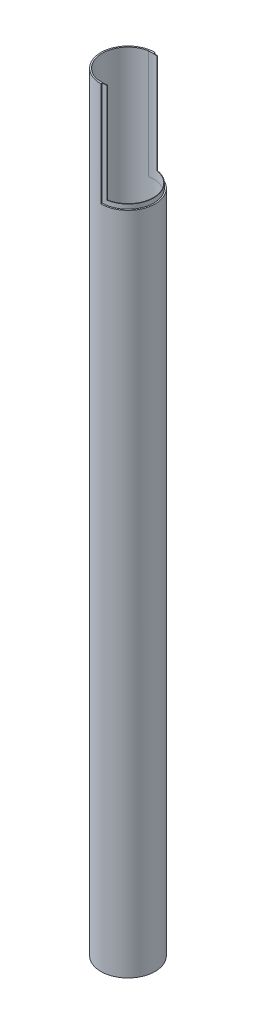
ISO-10303-21;
HEADER;
FILE_DESCRIPTION(('STEP AP214'),'2;1');
FILE_NAME('part.step','',(''),(''),'','','');
FILE_SCHEMA(('AUTOMOTIVE_DESIGN { 1 0 10303 214 1 1 1 1 }'));
ENDSEC;
DATA;
#1=APPLICATION_CONTEXT('core data for automotive mechanical design processes');
#2=APPLICATION_PROTOCOL_DEFINITION('international standard','automotive_design',2000,#1);
#3=PRODUCT_CONTEXT('',#1,'mechanical');
#4=PRODUCT('Part','Part','',(#3));
#5=PRODUCT_RELATED_PRODUCT_CATEGORY('part','',(#4));
#6=PRODUCT_DEFINITION_FORMATION('','',#4);
#7=PRODUCT_DEFINITION_CONTEXT('part definition',#1,'design');
#8=PRODUCT_DEFINITION('design','',#6,#7);
#9=PRODUCT_DEFINITION_SHAPE('','',#8);
#10=(LENGTH_UNIT() NAMED_UNIT(*) SI_UNIT(.MILLI.,.METRE.));
#11=(NAMED_UNIT(*) PLANE_ANGLE_UNIT() SI_UNIT($,.RADIAN.));
#12=(NAMED_UNIT(*) SI_UNIT($,.STERADIAN.) SOLID_ANGLE_UNIT());
#13=UNCERTAINTY_MEASURE_WITH_UNIT(LENGTH_MEASURE(1.E-05),#10,'distance_accuracy_value','');
#14=(GEOMETRIC_REPRESENTATION_CONTEXT(3) GLOBAL_UNCERTAINTY_ASSIGNED_CONTEXT((#13)) GLOBAL_UNIT_ASSIGNED_CONTEXT((#10,
#11,#12)) REPRESENTATION_CONTEXT('',''));
#15=CARTESIAN_POINT('',(0.,0.,0.));
#16=DIRECTION('',(0.,0.,1.));
#17=DIRECTION('',(1.,0.,0.));
#18=AXIS2_PLACEMENT_3D('',#15,#16,#17);
#19=CARTESIAN_POINT('',(0.,1239.,0.));
#20=DIRECTION('',(0.,-1.,0.));
#21=DIRECTION('',(0.,0.,-1.));
#22=AXIS2_PLACEMENT_3D('',#19,#20,#21);
#23=CYLINDRICAL_SURFACE('',#22,49.);
#24=CARTESIAN_POINT('',(0.,1239.,0.));
#25=DIRECTION('',(0.,-1.,0.));
#26=DIRECTION('',(0.,0.,-1.));
#27=AXIS2_PLACEMENT_3D('',#24,#25,#26);
#28=CIRCLE('',#27,49.);
#29=CARTESIAN_POINT('',(0.,1239.,-49.));
#30=VERTEX_POINT('',#29);
#31=EDGE_CURVE('E11',#30,#30,#28,.T.);
#32=ORIENTED_EDGE('',*,*,#31,.T.);
#33=EDGE_LOOP('',(#32));
#34=FACE_BOUND('',#33,.T.);
#35=CARTESIAN_POINT('',(0.,0.,0.));
#36=DIRECTION('',(0.,-1.,0.));
#37=DIRECTION('',(0.,0.,-1.));
#38=AXIS2_PLACEMENT_3D('',#35,#36,#37);
#39=CIRCLE('',#38,49.);
#40=CARTESIAN_POINT('',(0.,0.,-49.));
#41=VERTEX_POINT('',#40);
#42=EDGE_CURVE('E44',#41,#41,#39,.T.);
#43=ORIENTED_EDGE('',*,*,#42,.F.);
#44=EDGE_LOOP('',(#43));
#45=FACE_BOUND('',#44,.T.);
#46=ADVANCED_FACE('F41',(#34,#45),#23,.T.);
#47=CARTESIAN_POINT('',(0.,1239.,0.));
#48=DIRECTION('',(0.,-1.,0.));
#49=DIRECTION('',(0.,0.,-1.));
#50=AXIS2_PLACEMENT_3D('',#47,#48,#49);
#51=PLANE('',#50);
#52=ORIENTED_EDGE('',*,*,#31,.F.);
#53=EDGE_LOOP('',(#52));
#54=FACE_BOUND('',#53,.T.);
#55=ADVANCED_FACE('F56',(#54),#51,.F.);
#56=CARTESIAN_POINT('',(0.,0.,0.));
#57=DIRECTION('',(0.,-1.,0.));
#58=DIRECTION('',(0.,0.,-1.));
#59=AXIS2_PLACEMENT_3D('',#56,#57,#58);
#60=PLANE('',#59);
#61=ORIENTED_EDGE('',*,*,#42,.T.);
#62=EDGE_LOOP('',(#61));
#63=FACE_BOUND('',#62,.T.);
#64=ADVANCED_FACE('F53',(#63),#60,.T.);
#65=CLOSED_SHELL('',(#46,#55,#64));
#66=MANIFOLD_SOLID_BREP('B2',#65);
#67=CARTESIAN_POINT('',(0.,1700.,0.));
#68=DIRECTION('',(0.,-1.,0.));
#69=DIRECTION('',(0.,0.,-1.));
#70=AXIS2_PLACEMENT_3D('',#67,#68,#69);
#71=CYLINDRICAL_SURFACE('',#70,57.);
#72=CARTESIAN_POINT('',(0.,0.,0.));
#73=DIRECTION('',(0.,1.,0.));
#74=DIRECTION('',(0.,0.,1.));
#75=AXIS2_PLACEMENT_3D('',#72,#73,#74);
#76=CIRCLE('',#75,57.);
#77=CARTESIAN_POINT('',(0.,0.,57.));
#78=VERTEX_POINT('',#77);
#79=EDGE_CURVE('E249',#78,#78,#76,.T.);
#80=ORIENTED_EDGE('',*,*,#79,.F.);
#81=EDGE_LOOP('',(#80));
#82=FACE_BOUND('',#81,.T.);
#83=CARTESIAN_POINT('',(0.,1700.,0.));
#84=DIRECTION('',(0.,1.,0.));
#85=DIRECTION('',(0.,0.,1.));
#86=AXIS2_PLACEMENT_3D('',#83,#84,#85);
#87=CIRCLE('',#86,57.);
#88=CARTESIAN_POINT('',(-9.89794612701508,1700.,-56.1340419216958));
#89=VERTEX_POINT('',#88);
#90=CARTESIAN_POINT('',(-9.89794612701464,1700.,56.1340419216959));
#91=VERTEX_POINT('',#90);
#92=EDGE_CURVE('E250',#89,#91,#87,.T.);
#93=ORIENTED_EDGE('',*,*,#92,.T.);
#94=DIRECTION('',(0.,1.,0.));
#95=VECTOR('',#94,1.);
#96=CARTESIAN_POINT('',(-9.89794612701464,1460.,56.1340419216959));
#97=LINE('',#96,#95);
#98=CARTESIAN_POINT('',(-9.89794612701464,1460.,56.1340419216959));
#99=VERTEX_POINT('',#98);
#100=EDGE_CURVE('E97',#99,#91,#97,.T.);
#101=ORIENTED_EDGE('',*,*,#100,.F.);
#102=CARTESIAN_POINT('',(0.,1460.,0.));
#103=DIRECTION('',(0.,1.,0.));
#104=DIRECTION('',(0.,0.,1.));
#105=AXIS2_PLACEMENT_3D('',#102,#103,#104);
#106=CIRCLE('',#105,57.);
#107=CARTESIAN_POINT('',(-9.89794612701509,1460.,-56.1340419216958));
#108=VERTEX_POINT('',#107);
#109=EDGE_CURVE('E219',#99,#108,#106,.T.);
#110=ORIENTED_EDGE('',*,*,#109,.T.);
#111=DIRECTION('',(0.,1.,0.));
#112=VECTOR('',#111,1.);
#113=CARTESIAN_POINT('',(-9.89794612701508,1460.,-56.1340419216958));
#114=LINE('',#113,#112);
#115=EDGE_CURVE('E229',#108,#89,#114,.T.);
#116=ORIENTED_EDGE('',*,*,#115,.T.);
#117=EDGE_LOOP('',(#93,#101,#110,#116));
#118=FACE_BOUND('',#117,.T.);
#119=ADVANCED_FACE('F82',(#82,#118),#71,.F.);
#120=CARTESIAN_POINT('',(0.,1480.,0.));
#121=DIRECTION('',(0.,1.,0.));
#122=DIRECTION('',(0.,0.,1.));
#123=AXIS2_PLACEMENT_3D('',#120,#121,#122);
#124=PLANE('',#123);
#125=CARTESIAN_POINT('',(0.,1480.,0.));
#126=DIRECTION('',(0.,-1.,0.));
#127=DIRECTION('',(0.,0.,1.));
#128=AXIS2_PLACEMENT_3D('',#125,#126,#127);
#129=CIRCLE('',#128,56.);
#130=CARTESIAN_POINT('',(8.6521675073773,1480.,-55.3275699577009));
#131=VERTEX_POINT('',#130);
#132=CARTESIAN_POINT('',(9.72429794934853,1480.,55.1492341686836));
#133=VERTEX_POINT('',#132);
#134=EDGE_CURVE('E217',#131,#133,#129,.T.);
#135=ORIENTED_EDGE('',*,*,#134,.T.);
#136=DIRECTION('',(-0.173648177666938,0.,-0.984807753012207));
#137=VECTOR('',#136,1.);
#138=CARTESIAN_POINT('',(9.89794612701546,1480.,56.1340419216958));
#139=LINE('',#138,#137);
#140=CARTESIAN_POINT('',(9.89794612701546,1480.,56.1340419216958));
#141=VERTEX_POINT('',#140);
#142=EDGE_CURVE('E105',#141,#133,#139,.T.);
#143=ORIENTED_EDGE('',*,*,#142,.F.);
#144=CARTESIAN_POINT('',(0.,1480.,0.));
#145=DIRECTION('',(0.,1.,0.));
#146=DIRECTION('',(0.,0.,1.));
#147=AXIS2_PLACEMENT_3D('',#144,#145,#146);
#148=CIRCLE('',#147,57.);
#149=CARTESIAN_POINT('',(8.80667049858047,1480.,-56.3155622783741));
#150=VERTEX_POINT('',#149);
#151=EDGE_CURVE('E193',#141,#150,#148,.T.);
#152=ORIENTED_EDGE('',*,*,#151,.T.);
#153=DIRECTION('',(0.154502991203171,0.,-0.987992320673229));
#154=VECTOR('',#153,1.);
#155=CARTESIAN_POINT('',(8.80667049858047,1480.,-56.3155622783741));
#156=LINE('',#155,#154);
#157=EDGE_CURVE('E194',#131,#150,#156,.T.);
#158=ORIENTED_EDGE('',*,*,#157,.F.);
#159=EDGE_LOOP('',(#135,#143,#152,#158));
#160=FACE_BOUND('',#159,.T.);
#161=ADVANCED_FACE('F290',(#160),#124,.T.);
#162=CARTESIAN_POINT('',(0.,1700.,0.));
#163=DIRECTION('',(0.,1.,0.));
#164=DIRECTION('',(0.,0.,1.));
#165=AXIS2_PLACEMENT_3D('',#162,#163,#164);
#166=PLANE('',#165);
#167=CARTESIAN_POINT('',(0.,1700.,0.));
#168=DIRECTION('',(0.,1.,0.));
#169=DIRECTION('',(0.,0.,1.));
#170=AXIS2_PLACEMENT_3D('',#167,#168,#169);
#171=CIRCLE('',#170,60.);
#172=CARTESIAN_POINT('',(0.,1700.,-60.));
#173=VERTEX_POINT('',#172);
#174=CARTESIAN_POINT('',(0.,1700.,60.));
#175=VERTEX_POINT('',#174);
#176=EDGE_CURVE('E255',#173,#175,#171,.T.);
#177=ORIENTED_EDGE('',*,*,#176,.T.);
#178=DIRECTION('',(0.,0.,-1.));
#179=VECTOR('',#178,1.);
#180=CARTESIAN_POINT('',(0.,1700.,1239.));
#181=LINE('',#180,#179);
#182=CARTESIAN_POINT('',(0.,1700.,57.));
#183=VERTEX_POINT('',#182);
#184=EDGE_CURVE('E178',#175,#183,#181,.T.);
#185=ORIENTED_EDGE('',*,*,#184,.T.);
#186=CARTESIAN_POINT('',(0.,1700.,0.));
#187=DIRECTION('',(0.,1.,0.));
#188=DIRECTION('',(0.,0.,1.));
#189=AXIS2_PLACEMENT_3D('',#186,#187,#188);
#190=CIRCLE('',#189,57.);
#191=CARTESIAN_POINT('',(9.89794612701546,1700.,56.1340419216958));
#192=VERTEX_POINT('',#191);
#193=EDGE_CURVE('E171',#183,#192,#190,.T.);
#194=ORIENTED_EDGE('',*,*,#193,.T.);
#195=DIRECTION('',(-0.173648177666938,0.,-0.984807753012207));
#196=VECTOR('',#195,1.);
#197=CARTESIAN_POINT('',(9.89794612701546,1700.,56.1340419216958));
#198=LINE('',#197,#196);
#199=CARTESIAN_POINT('',(9.72429794934853,1700.,55.1492341686836));
#200=VERTEX_POINT('',#199);
#201=EDGE_CURVE('E176',#192,#200,#198,.T.);
#202=ORIENTED_EDGE('',*,*,#201,.T.);
#203=CARTESIAN_POINT('',(0.,1700.,0.));
#204=DIRECTION('',(0.,-1.,0.));
#205=DIRECTION('',(0.,0.,1.));
#206=AXIS2_PLACEMENT_3D('',#203,#204,#205);
#207=CIRCLE('',#206,56.);
#208=CARTESIAN_POINT('',(-9.72429794934771,1700.,55.1492341686837));
#209=VERTEX_POINT('',#208);
#210=EDGE_CURVE('E189',#200,#209,#207,.T.);
#211=ORIENTED_EDGE('',*,*,#210,.T.);
#212=DIRECTION('',(-0.173648177666926,0.,0.984807753012209));
#213=VECTOR('',#212,1.);
#214=CARTESIAN_POINT('',(-9.89794612701464,1700.,56.1340419216959));
#215=LINE('',#214,#213);
#216=EDGE_CURVE('E199',#209,#91,#215,.T.);
#217=ORIENTED_EDGE('',*,*,#216,.T.);
#218=ORIENTED_EDGE('',*,*,#92,.F.);
#219=DIRECTION('',(0.173648177666931,0.,0.984807753012208));
#220=VECTOR('',#219,1.);
#221=CARTESIAN_POINT('',(-9.89794612701508,1700.,-56.1340419216958));
#222=LINE('',#221,#220);
#223=CARTESIAN_POINT('',(-9.72429794934815,1700.,-55.1492341686836));
#224=VERTEX_POINT('',#223);
#225=EDGE_CURVE('E205',#89,#224,#222,.T.);
#226=ORIENTED_EDGE('',*,*,#225,.T.);
#227=CARTESIAN_POINT('',(0.,1700.,0.));
#228=DIRECTION('',(0.,-1.,0.));
#229=DIRECTION('',(0.,0.,1.));
#230=AXIS2_PLACEMENT_3D('',#227,#228,#229);
#231=CIRCLE('',#230,56.);
#232=CARTESIAN_POINT('',(8.65216750737731,1700.,-55.3275699577009));
#233=VERTEX_POINT('',#232);
#234=EDGE_CURVE('E208',#224,#233,#231,.T.);
#235=ORIENTED_EDGE('',*,*,#234,.T.);
#236=DIRECTION('',(0.154502991203171,0.,-0.987992320673229));
#237=VECTOR('',#236,1.);
#238=CARTESIAN_POINT('',(8.80667049858047,1700.,-56.3155622783741));
#239=LINE('',#238,#237);
#240=CARTESIAN_POINT('',(8.80667049858047,1700.,-56.3155622783741));
#241=VERTEX_POINT('',#240);
#242=EDGE_CURVE('E210',#233,#241,#239,.T.);
#243=ORIENTED_EDGE('',*,*,#242,.T.);
#244=CARTESIAN_POINT('',(0.,1700.,0.));
#245=DIRECTION('',(0.,1.,0.));
#246=DIRECTION('',(0.,0.,1.));
#247=AXIS2_PLACEMENT_3D('',#244,#245,#246);
#248=CIRCLE('',#247,57.);
#249=CARTESIAN_POINT('',(0.,1700.,-57.));
#250=VERTEX_POINT('',#249);
#251=EDGE_CURVE('E197',#241,#250,#248,.T.);
#252=ORIENTED_EDGE('',*,*,#251,.T.);
#253=EDGE_CURVE('E231',#250,#173,#181,.T.);
#254=ORIENTED_EDGE('',*,*,#253,.T.);
#255=EDGE_LOOP('',(#177,#185,#194,#202,#211,#217,#218,#226,#235,#243,#252,#254));
#256=FACE_BOUND('',#255,.T.);
#257=ADVANCED_FACE('F174',(#256),#166,.T.);
#258=CARTESIAN_POINT('',(0.,1700.,0.));
#259=DIRECTION('',(0.,-1.,0.));
#260=DIRECTION('',(0.,0.,-1.));
#261=AXIS2_PLACEMENT_3D('',#258,#259,#260);
#262=CYLINDRICAL_SURFACE('',#261,60.);
#263=CARTESIAN_POINT('',(0.,0.,0.));
#264=DIRECTION('',(0.,1.,0.));
#265=DIRECTION('',(0.,0.,1.));
#266=AXIS2_PLACEMENT_3D('',#263,#264,#265);
#267=CIRCLE('',#266,60.);
#268=CARTESIAN_POINT('',(0.,0.,60.));
#269=VERTEX_POINT('',#268);
#270=EDGE_CURVE('E252',#269,#269,#267,.T.);
#271=ORIENTED_EDGE('',*,*,#270,.T.);
#272=EDGE_LOOP('',(#271));
#273=FACE_BOUND('',#272,.T.);
#274=DIRECTION('',(0.,-1.,0.));
#275=VECTOR('',#274,1.);
#276=CARTESIAN_POINT('',(0.,1700.,60.));
#277=LINE('',#276,#275);
#278=CARTESIAN_POINT('',(0.,1470.,60.));
#279=VERTEX_POINT('',#278);
#280=EDGE_CURVE('E247',#175,#279,#277,.T.);
#281=ORIENTED_EDGE('',*,*,#280,.F.);
#282=ORIENTED_EDGE('',*,*,#176,.F.);
#283=DIRECTION('',(0.,-1.,0.));
#284=VECTOR('',#283,1.);
#285=CARTESIAN_POINT('',(0.,1700.,-60.));
#286=LINE('',#285,#284);
#287=CARTESIAN_POINT('',(0.,1470.,-60.));
#288=VERTEX_POINT('',#287);
#289=EDGE_CURVE('E245',#288,#173,#286,.F.);
#290=ORIENTED_EDGE('',*,*,#289,.F.);
#291=CARTESIAN_POINT('',(0.,1470.,0.));
#292=DIRECTION('',(0.,1.,0.));
#293=DIRECTION('',(0.,0.,1.));
#294=AXIS2_PLACEMENT_3D('',#291,#292,#293);
#295=CIRCLE('',#294,60.);
#296=EDGE_CURVE('E243',#279,#288,#295,.T.);
#297=ORIENTED_EDGE('',*,*,#296,.F.);
#298=EDGE_LOOP('',(#281,#282,#290,#297));
#299=FACE_BOUND('',#298,.T.);
#300=ADVANCED_FACE('F84',(#273,#299),#262,.T.);
#301=CARTESIAN_POINT('',(0.,0.,0.));
#302=DIRECTION('',(0.,1.,0.));
#303=DIRECTION('',(0.,0.,1.));
#304=AXIS2_PLACEMENT_3D('',#301,#302,#303);
#305=PLANE('',#304);
#306=ORIENTED_EDGE('',*,*,#270,.F.);
#307=EDGE_LOOP('',(#306));
#308=FACE_BOUND('',#307,.T.);
#309=ORIENTED_EDGE('',*,*,#79,.T.);
#310=EDGE_LOOP('',(#309));
#311=FACE_BOUND('',#310,.T.);
#312=ADVANCED_FACE('F301',(#308,#311),#305,.F.);
#313=CARTESIAN_POINT('',(0.,1700.,1239.));
#314=DIRECTION('',(1.,0.,0.));
#315=DIRECTION('',(0.,1.,0.));
#316=AXIS2_PLACEMENT_3D('',#313,#314,#315);
#317=PLANE('',#316);
#318=ORIENTED_EDGE('',*,*,#280,.T.);
#319=DIRECTION('',(0.,0.,-1.));
#320=VECTOR('',#319,1.);
#321=CARTESIAN_POINT('',(0.,1470.,1239.));
#322=LINE('',#321,#320);
#323=CARTESIAN_POINT('',(0.,1470.,57.));
#324=VERTEX_POINT('',#323);
#325=EDGE_CURVE('E242',#279,#324,#322,.T.);
#326=ORIENTED_EDGE('',*,*,#325,.T.);
#327=DIRECTION('',(0.,-1.,0.));
#328=VECTOR('',#327,1.);
#329=CARTESIAN_POINT('',(0.,1700.,57.));
#330=LINE('',#329,#328);
#331=EDGE_CURVE('E39',#183,#324,#330,.T.);
#332=ORIENTED_EDGE('',*,*,#331,.F.);
#333=ORIENTED_EDGE('',*,*,#184,.F.);
#334=EDGE_LOOP('',(#318,#326,#332,#333));
#335=FACE_BOUND('',#334,.T.);
#336=ADVANCED_FACE('F277',(#335),#317,.T.);
#337=ORIENTED_EDGE('',*,*,#289,.T.);
#338=ORIENTED_EDGE('',*,*,#253,.F.);
#339=DIRECTION('',(0.,-1.,0.));
#340=VECTOR('',#339,1.);
#341=CARTESIAN_POINT('',(0.,1700.,-57.));
#342=LINE('',#341,#340);
#343=CARTESIAN_POINT('',(0.,1470.,-57.));
#344=VERTEX_POINT('',#343);
#345=EDGE_CURVE('E90',#344,#250,#342,.F.);
#346=ORIENTED_EDGE('',*,*,#345,.F.);
#347=EDGE_CURVE('E239',#344,#288,#322,.T.);
#348=ORIENTED_EDGE('',*,*,#347,.T.);
#349=EDGE_LOOP('',(#337,#338,#346,#348));
#350=FACE_BOUND('',#349,.T.);
#351=ADVANCED_FACE('F269',(#350),#317,.T.);
#352=CARTESIAN_POINT('',(0.,1470.,1239.));
#353=DIRECTION('',(0.,1.,0.));
#354=DIRECTION('',(0.,0.,1.));
#355=AXIS2_PLACEMENT_3D('',#352,#353,#354);
#356=PLANE('',#355);
#357=ORIENTED_EDGE('',*,*,#296,.T.);
#358=ORIENTED_EDGE('',*,*,#347,.F.);
#359=CARTESIAN_POINT('',(0.,1470.,0.));
#360=DIRECTION('',(0.,1.,0.));
#361=DIRECTION('',(0.,0.,1.));
#362=AXIS2_PLACEMENT_3D('',#359,#360,#361);
#363=CIRCLE('',#362,57.);
#364=EDGE_CURVE('E257',#324,#344,#363,.T.);
#365=ORIENTED_EDGE('',*,*,#364,.F.);
#366=ORIENTED_EDGE('',*,*,#325,.F.);
#367=EDGE_LOOP('',(#357,#358,#365,#366));
#368=FACE_BOUND('',#367,.T.);
#369=ADVANCED_FACE('F279',(#368),#356,.T.);
#370=CARTESIAN_POINT('',(0.,1460.,0.));
#371=DIRECTION('',(0.,1.,0.));
#372=DIRECTION('',(0.,0.,1.));
#373=AXIS2_PLACEMENT_3D('',#370,#371,#372);
#374=CYLINDRICAL_SURFACE('',#373,57.);
#375=ORIENTED_EDGE('',*,*,#151,.F.);
#376=DIRECTION('',(0.,-1.,0.));
#377=VECTOR('',#376,1.);
#378=CARTESIAN_POINT('',(9.89794612701546,1700.,56.1340419216958));
#379=LINE('',#378,#377);
#380=EDGE_CURVE('E185',#192,#141,#379,.T.);
#381=ORIENTED_EDGE('',*,*,#380,.F.);
#382=ORIENTED_EDGE('',*,*,#193,.F.);
#383=ORIENTED_EDGE('',*,*,#331,.T.);
#384=ORIENTED_EDGE('',*,*,#364,.T.);
#385=ORIENTED_EDGE('',*,*,#345,.T.);
#386=ORIENTED_EDGE('',*,*,#251,.F.);
#387=DIRECTION('',(0.,-1.,0.));
#388=VECTOR('',#387,1.);
#389=CARTESIAN_POINT('',(8.80667049858047,1700.,-56.3155622783741));
#390=LINE('',#389,#388);
#391=EDGE_CURVE('E211',#241,#150,#390,.T.);
#392=ORIENTED_EDGE('',*,*,#391,.T.);
#393=EDGE_LOOP('',(#375,#381,#382,#383,#384,#385,#386,#392));
#394=FACE_BOUND('',#393,.T.);
#395=ADVANCED_FACE('F191',(#394),#374,.T.);
#396=CARTESIAN_POINT('',(-9.72429794934771,1460.,55.1492341686837));
#397=DIRECTION('',(-0.984807753012209,0.,-0.173648177666924));
#398=DIRECTION('',(-0.173648177666924,0.,0.984807753012209));
#399=AXIS2_PLACEMENT_3D('',#396,#397,#398);
#400=PLANE('',#399);
#401=ORIENTED_EDGE('',*,*,#100,.T.);
#402=ORIENTED_EDGE('',*,*,#216,.F.);
#403=DIRECTION('',(0.,1.,0.));
#404=VECTOR('',#403,1.);
#405=CARTESIAN_POINT('',(-9.72429794934771,1460.,55.1492341686837));
#406=LINE('',#405,#404);
#407=CARTESIAN_POINT('',(-9.72429794934771,1460.,55.1492341686837));
#408=VERTEX_POINT('',#407);
#409=EDGE_CURVE('E232',#408,#209,#406,.T.);
#410=ORIENTED_EDGE('',*,*,#409,.F.);
#411=DIRECTION('',(-0.173648177666924,0.,0.984807753012209));
#412=VECTOR('',#411,1.);
#413=CARTESIAN_POINT('',(-9.72429794934771,1460.,55.1492341686837));
#414=LINE('',#413,#412);
#415=EDGE_CURVE('E227',#408,#99,#414,.T.);
#416=ORIENTED_EDGE('',*,*,#415,.T.);
#417=EDGE_LOOP('',(#401,#402,#410,#416));
#418=FACE_BOUND('',#417,.T.);
#419=ADVANCED_FACE('F286',(#418),#400,.T.);
#420=CARTESIAN_POINT('',(0.,1460.,0.));
#421=DIRECTION('',(0.,1.,0.));
#422=DIRECTION('',(0.,0.,1.));
#423=AXIS2_PLACEMENT_3D('',#420,#421,#422);
#424=CYLINDRICAL_SURFACE('',#423,56.);
#425=ORIENTED_EDGE('',*,*,#409,.T.);
#426=ORIENTED_EDGE('',*,*,#210,.F.);
#427=DIRECTION('',(0.,-1.,0.));
#428=VECTOR('',#427,1.);
#429=CARTESIAN_POINT('',(9.72429794934853,1700.,55.1492341686836));
#430=LINE('',#429,#428);
#431=EDGE_CURVE('E187',#200,#133,#430,.T.);
#432=ORIENTED_EDGE('',*,*,#431,.T.);
#433=ORIENTED_EDGE('',*,*,#134,.F.);
#434=DIRECTION('',(0.,-1.,0.));
#435=VECTOR('',#434,1.);
#436=CARTESIAN_POINT('',(8.65216750737731,1700.,-55.3275699577009));
#437=LINE('',#436,#435);
#438=EDGE_CURVE('E214',#233,#131,#437,.T.);
#439=ORIENTED_EDGE('',*,*,#438,.F.);
#440=ORIENTED_EDGE('',*,*,#234,.F.);
#441=DIRECTION('',(0.,1.,0.));
#442=VECTOR('',#441,1.);
#443=CARTESIAN_POINT('',(-9.72429794934815,1460.,-55.1492341686836));
#444=LINE('',#443,#442);
#445=CARTESIAN_POINT('',(-9.72429794934815,1460.,-55.1492341686836));
#446=VERTEX_POINT('',#445);
#447=EDGE_CURVE('E234',#446,#224,#444,.T.);
#448=ORIENTED_EDGE('',*,*,#447,.F.);
#449=CARTESIAN_POINT('',(0.,1460.,0.));
#450=DIRECTION('',(0.,-1.,0.));
#451=DIRECTION('',(0.,0.,1.));
#452=AXIS2_PLACEMENT_3D('',#449,#450,#451);
#453=CIRCLE('',#452,56.);
#454=EDGE_CURVE('E224',#446,#408,#453,.T.);
#455=ORIENTED_EDGE('',*,*,#454,.T.);
#456=EDGE_LOOP('',(#425,#426,#432,#433,#439,#440,#448,#455));
#457=FACE_BOUND('',#456,.T.);
#458=ADVANCED_FACE('F368',(#457),#424,.F.);
#459=CARTESIAN_POINT('',(-9.72429794934815,1460.,-55.1492341686836));
#460=DIRECTION('',(-0.984807753012208,0.,0.173648177666931));
#461=DIRECTION('',(0.173648177666931,0.,0.984807753012208));
#462=AXIS2_PLACEMENT_3D('',#459,#460,#461);
#463=PLANE('',#462);
#464=ORIENTED_EDGE('',*,*,#447,.T.);
#465=ORIENTED_EDGE('',*,*,#225,.F.);
#466=ORIENTED_EDGE('',*,*,#115,.F.);
#467=DIRECTION('',(0.173648177666931,0.,0.984807753012208));
#468=VECTOR('',#467,1.);
#469=CARTESIAN_POINT('',(-9.72429794934815,1460.,-55.1492341686836));
#470=LINE('',#469,#468);
#471=EDGE_CURVE('E221',#108,#446,#470,.T.);
#472=ORIENTED_EDGE('',*,*,#471,.T.);
#473=EDGE_LOOP('',(#464,#465,#466,#472));
#474=FACE_BOUND('',#473,.T.);
#475=ADVANCED_FACE('F337',(#474),#463,.T.);
#476=CARTESIAN_POINT('',(0.,1460.,0.));
#477=DIRECTION('',(0.,1.,0.));
#478=DIRECTION('',(0.,0.,1.));
#479=AXIS2_PLACEMENT_3D('',#476,#477,#478);
#480=PLANE('',#479);
#481=ORIENTED_EDGE('',*,*,#109,.F.);
#482=ORIENTED_EDGE('',*,*,#415,.F.);
#483=ORIENTED_EDGE('',*,*,#454,.F.);
#484=ORIENTED_EDGE('',*,*,#471,.F.);
#485=EDGE_LOOP('',(#481,#482,#483,#484));
#486=FACE_BOUND('',#485,.T.);
#487=ADVANCED_FACE('F333',(#486),#480,.F.);
#488=CARTESIAN_POINT('',(8.80667049858047,1700.,-56.3155622783741));
#489=DIRECTION('',(-0.987992320673229,0.,-0.154502991203171));
#490=DIRECTION('',(-0.154502991203171,0.,0.987992320673229));
#491=AXIS2_PLACEMENT_3D('',#488,#489,#490);
#492=PLANE('',#491);
#493=ORIENTED_EDGE('',*,*,#157,.T.);
#494=ORIENTED_EDGE('',*,*,#391,.F.);
#495=ORIENTED_EDGE('',*,*,#242,.F.);
#496=ORIENTED_EDGE('',*,*,#438,.T.);
#497=EDGE_LOOP('',(#493,#494,#495,#496));
#498=FACE_BOUND('',#497,.T.);
#499=ADVANCED_FACE('F336',(#498),#492,.F.);
#500=CARTESIAN_POINT('',(9.89794612701546,1700.,56.1340419216958));
#501=DIRECTION('',(-0.984807753012207,0.,0.173648177666938));
#502=DIRECTION('',(0.173648177666938,0.,0.984807753012207));
#503=AXIS2_PLACEMENT_3D('',#500,#501,#502);
#504=PLANE('',#503);
#505=ORIENTED_EDGE('',*,*,#142,.T.);
#506=ORIENTED_EDGE('',*,*,#431,.F.);
#507=ORIENTED_EDGE('',*,*,#201,.F.);
#508=ORIENTED_EDGE('',*,*,#380,.T.);
#509=EDGE_LOOP('',(#505,#506,#507,#508));
#510=FACE_BOUND('',#509,.T.);
#511=ADVANCED_FACE('F184',(#510),#504,.F.);
#512=CLOSED_SHELL('',(#119,#161,#257,#300,#312,#336,#351,#369,#395,#419,#458,#475,#487,#499,#511));
#513=MANIFOLD_SOLID_BREP('B6',#512);
#514=ADVANCED_BREP_SHAPE_REPRESENTATION('',(#18,#66,#513),#14);
#515=SHAPE_DEFINITION_REPRESENTATION(#9,#514);
ENDSEC;
END-ISO-10303-21;
